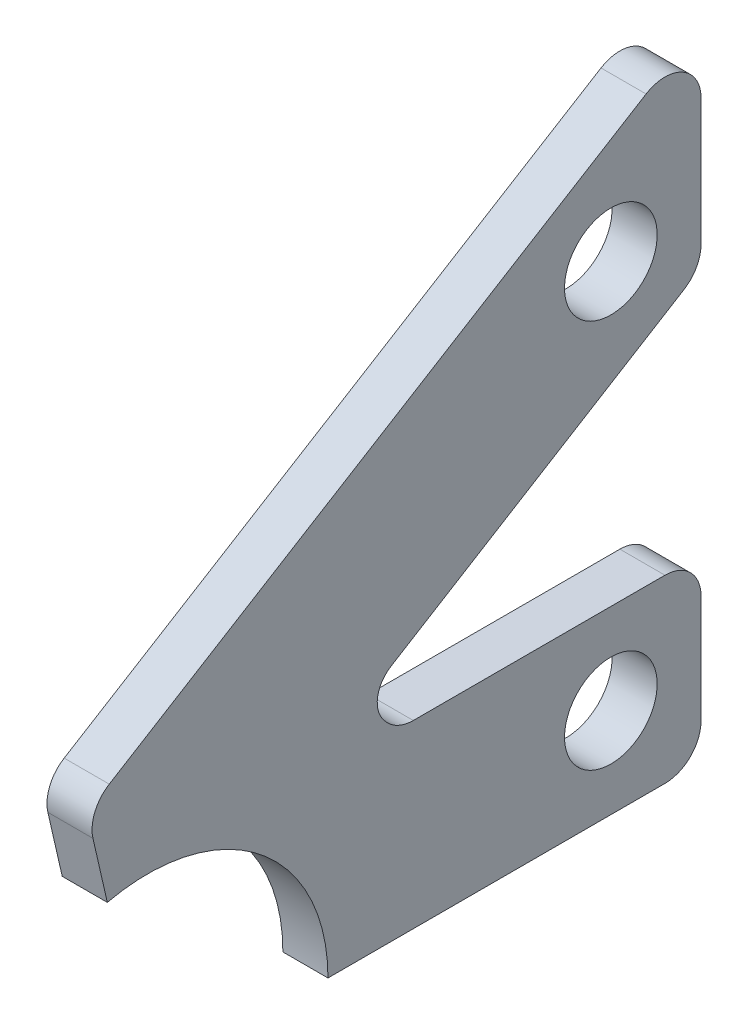
ISO-10303-21;
HEADER;
FILE_DESCRIPTION(('STEP AP214'),'2;1');
FILE_NAME('part.step','',(''),(''),'','','');
FILE_SCHEMA(('AUTOMOTIVE_DESIGN { 1 0 10303 214 1 1 1 1 }'));
ENDSEC;
DATA;
#1=APPLICATION_CONTEXT('core data for automotive mechanical design processes');
#2=APPLICATION_PROTOCOL_DEFINITION('international standard','automotive_design',2000,#1);
#3=PRODUCT_CONTEXT('',#1,'mechanical');
#4=PRODUCT('Part','Part','',(#3));
#5=PRODUCT_RELATED_PRODUCT_CATEGORY('part','',(#4));
#6=PRODUCT_DEFINITION_FORMATION('','',#4);
#7=PRODUCT_DEFINITION_CONTEXT('part definition',#1,'design');
#8=PRODUCT_DEFINITION('design','',#6,#7);
#9=PRODUCT_DEFINITION_SHAPE('','',#8);
#10=(LENGTH_UNIT() NAMED_UNIT(*) SI_UNIT(.MILLI.,.METRE.));
#11=(NAMED_UNIT(*) PLANE_ANGLE_UNIT() SI_UNIT($,.RADIAN.));
#12=(NAMED_UNIT(*) SI_UNIT($,.STERADIAN.) SOLID_ANGLE_UNIT());
#13=UNCERTAINTY_MEASURE_WITH_UNIT(LENGTH_MEASURE(1.E-05),#10,'distance_accuracy_value','');
#14=(GEOMETRIC_REPRESENTATION_CONTEXT(3) GLOBAL_UNCERTAINTY_ASSIGNED_CONTEXT((#13)) GLOBAL_UNIT_ASSIGNED_CONTEXT((#10,
#11,#12)) REPRESENTATION_CONTEXT('',''));
#15=CARTESIAN_POINT('',(0.,0.,0.));
#16=DIRECTION('',(0.,0.,1.));
#17=DIRECTION('',(1.,0.,0.));
#18=AXIS2_PLACEMENT_3D('',#15,#16,#17);
#19=CARTESIAN_POINT('',(-115.73,634.1714119077,38.9687598546462));
#20=DIRECTION('',(1.,0.,0.));
#21=DIRECTION('',(0.,0.,-1.));
#22=AXIS2_PLACEMENT_3D('',#19,#20,#21);
#23=PLANE('',#22);
#24=CARTESIAN_POINT('',(-115.73,634.1714119077,38.9687598546462));
#25=DIRECTION('',(1.,0.,0.));
#26=DIRECTION('',(0.,0.,-1.));
#27=AXIS2_PLACEMENT_3D('',#24,#25,#26);
#28=CIRCLE('',#27,12.7000000000001);
#29=CARTESIAN_POINT('',(-115.73,634.1714119077,26.268759854646));
#30=VERTEX_POINT('',#29);
#31=CARTESIAN_POINT('',(-115.73,646.550348368886,41.8063525121487));
#32=VERTEX_POINT('',#31);
#33=EDGE_CURVE('E224',#30,#32,#28,.T.);
#34=ORIENTED_EDGE('',*,*,#33,.T.);
#35=DIRECTION('',(0.,0.974719406392616,0.223432492716761));
#36=VECTOR('',#35,1.);
#37=CARTESIAN_POINT('',(-115.73,646.550348368886,41.8063525121487));
#38=LINE('',#37,#36);
#39=CARTESIAN_POINT('',(-115.73,650.961224657136,42.8174466564589));
#40=VERTEX_POINT('',#39);
#41=EDGE_CURVE('E132',#32,#40,#38,.T.);
#42=ORIENTED_EDGE('',*,*,#41,.T.);
#43=CARTESIAN_POINT('',(-115.73,651.528743188637,40.3416593642216));
#44=DIRECTION('',(-1.,0.,0.));
#45=DIRECTION('',(0.,0.,1.));
#46=AXIS2_PLACEMENT_3D('',#43,#44,#45);
#47=CIRCLE('',#46,2.54000000000001);
#48=CARTESIAN_POINT('',(-115.73,653.693888378389,41.6697204724902));
#49=VERTEX_POINT('',#48);
#50=EDGE_CURVE('E264',#40,#49,#47,.T.);
#51=ORIENTED_EDGE('',*,*,#50,.T.);
#52=DIRECTION('',(0.,0.522858704042732,-0.852419366043941));
#53=VECTOR('',#52,1.);
#54=CARTESIAN_POINT('',(-115.73,653.693888378389,41.6697204724902));
#55=LINE('',#54,#53);
#56=CARTESIAN_POINT('',(-115.73,676.880746177702,3.8680611082686));
#57=VERTEX_POINT('',#56);
#58=EDGE_CURVE('E283',#49,#57,#55,.T.);
#59=ORIENTED_EDGE('',*,*,#58,.T.);
#60=CARTESIAN_POINT('',(-115.73,674.715600987951,2.53999999999999));
#61=DIRECTION('',(-1.,0.,0.));
#62=DIRECTION('',(0.,0.,-1.));
#63=AXIS2_PLACEMENT_3D('',#60,#61,#62);
#64=CIRCLE('',#63,2.53999999999997);
#65=CARTESIAN_POINT('',(-115.73,674.71560098795,-1.11022302462516E-13));
#66=VERTEX_POINT('',#65);
#67=EDGE_CURVE('E280',#57,#66,#64,.T.);
#68=ORIENTED_EDGE('',*,*,#67,.T.);
#69=DIRECTION('',(0.,-1.,0.));
#70=VECTOR('',#69,1.);
#71=CARTESIAN_POINT('',(-115.73,665.776339043018,1.11022302462516E-13));
#72=LINE('',#71,#70);
#73=CARTESIAN_POINT('',(-115.73,665.776339043018,2.33753988387875E-13));
#74=VERTEX_POINT('',#73);
#75=EDGE_CURVE('E282',#66,#74,#72,.T.);
#76=ORIENTED_EDGE('',*,*,#75,.T.);
#77=CARTESIAN_POINT('',(-115.73,665.776339043018,2.53999999999999));
#78=DIRECTION('',(-1.,0.,0.));
#79=DIRECTION('',(0.,0.,-1.));
#80=AXIS2_PLACEMENT_3D('',#77,#78,#79);
#81=CIRCLE('',#80,2.53999999999975);
#82=CARTESIAN_POINT('',(-115.73,663.611193853267,1.21193889173166));
#83=VERTEX_POINT('',#82);
#84=EDGE_CURVE('E285',#74,#83,#81,.T.);
#85=ORIENTED_EDGE('',*,*,#84,.T.);
#86=DIRECTION('',(0.,-0.522858704042737,0.852419366043938));
#87=VECTOR('',#86,1.);
#88=CARTESIAN_POINT('',(-115.73,650.963145372482,21.8321205666689));
#89=LINE('',#88,#87);
#90=CARTESIAN_POINT('',(-115.73,650.963145372482,21.8321205666689));
#91=VERTEX_POINT('',#90);
#92=EDGE_CURVE('E291',#83,#91,#89,.T.);
#93=ORIENTED_EDGE('',*,*,#92,.T.);
#94=CARTESIAN_POINT('',(-115.73,649.23102922068,20.7696716800541));
#95=DIRECTION('',(1.,0.,0.));
#96=DIRECTION('',(0.,0.,-1.));
#97=AXIS2_PLACEMENT_3D('',#94,#95,#96);
#98=CIRCLE('',#97,2.03200000000014);
#99=CARTESIAN_POINT('',(-115.73,647.935578269026,22.3351846413093));
#100=VERTEX_POINT('',#99);
#101=EDGE_CURVE('E293',#91,#100,#98,.T.);
#102=ORIENTED_EDGE('',*,*,#101,.T.);
#103=CARTESIAN_POINT('',(-115.73,634.1714119077,38.9687598546462));
#104=DIRECTION('',(-1.,0.,0.));
#105=DIRECTION('',(0.,0.,1.));
#106=AXIS2_PLACEMENT_3D('',#103,#104,#105);
#107=CIRCLE('',#106,21.59);
#108=CARTESIAN_POINT('',(-115.73,647.807201381384,22.2297830212382));
#109=VERTEX_POINT('',#108);
#110=EDGE_CURVE('E295',#100,#109,#107,.T.);
#111=ORIENTED_EDGE('',*,*,#110,.T.);
#112=CARTESIAN_POINT('',(-115.73,649.4114119077,20.2604916290725));
#113=DIRECTION('',(1.,0.,0.));
#114=DIRECTION('',(0.,0.,1.));
#115=AXIS2_PLACEMENT_3D('',#112,#113,#114);
#116=CIRCLE('',#115,2.54000000000006);
#117=CARTESIAN_POINT('',(-115.73,646.8714119077,20.2604916290726));
#118=VERTEX_POINT('',#117);
#119=EDGE_CURVE('E297',#109,#118,#116,.T.);
#120=ORIENTED_EDGE('',*,*,#119,.T.);
#121=DIRECTION('',(0.,0.,-1.));
#122=VECTOR('',#121,1.);
#123=CARTESIAN_POINT('',(-115.73,646.871411907699,2.54000000000043));
#124=LINE('',#123,#122);
#125=CARTESIAN_POINT('',(-115.73,646.871411907699,2.54000000000043));
#126=VERTEX_POINT('',#125);
#127=EDGE_CURVE('E299',#118,#126,#124,.T.);
#128=ORIENTED_EDGE('',*,*,#127,.T.);
#129=CARTESIAN_POINT('',(-115.73,644.3314119077,2.54000000000032));
#130=DIRECTION('',(-1.,0.,0.));
#131=DIRECTION('',(0.,0.,1.));
#132=AXIS2_PLACEMENT_3D('',#129,#130,#131);
#133=CIRCLE('',#132,2.53999999999993);
#134=CARTESIAN_POINT('',(-115.73,644.331411907699,3.33066907387547E-13));
#135=VERTEX_POINT('',#134);
#136=EDGE_CURVE('E175',#126,#135,#133,.T.);
#137=ORIENTED_EDGE('',*,*,#136,.T.);
#138=DIRECTION('',(0.,-1.,0.));
#139=VECTOR('',#138,1.);
#140=CARTESIAN_POINT('',(-115.73,636.711411907699,4.44089209850063E-13));
#141=LINE('',#140,#139);
#142=CARTESIAN_POINT('',(-115.73,636.711411907699,4.9960036108132E-13));
#143=VERTEX_POINT('',#142);
#144=EDGE_CURVE('E169',#135,#143,#141,.T.);
#145=ORIENTED_EDGE('',*,*,#144,.T.);
#146=CARTESIAN_POINT('',(-115.73,636.711411907699,2.54000000000043));
#147=DIRECTION('',(-1.,0.,0.));
#148=DIRECTION('',(0.,0.,-1.));
#149=AXIS2_PLACEMENT_3D('',#146,#147,#148);
#150=CIRCLE('',#149,2.53999999999993);
#151=CARTESIAN_POINT('',(-115.73,634.1714119077,2.54000000000043));
#152=VERTEX_POINT('',#151);
#153=EDGE_CURVE('E173',#143,#152,#150,.T.);
#154=ORIENTED_EDGE('',*,*,#153,.T.);
#155=DIRECTION('',(0.,0.,1.));
#156=VECTOR('',#155,1.);
#157=CARTESIAN_POINT('',(-115.73,634.1714119077,2.54000000000043));
#158=LINE('',#157,#156);
#159=EDGE_CURVE('E65',#152,#30,#158,.T.);
#160=ORIENTED_EDGE('',*,*,#159,.T.);
#161=EDGE_LOOP('',(#34,#42,#51,#59,#68,#76,#85,#93,#102,#111,#120,#128,#137,#145,#154,#160));
#162=FACE_BOUND('',#161,.T.);
#163=CARTESIAN_POINT('',(-115.73,640.5214119077,6.3500000000003));
#164=DIRECTION('',(-1.,0.,0.));
#165=DIRECTION('',(0.,0.,1.));
#166=AXIS2_PLACEMENT_3D('',#163,#164,#165);
#167=CIRCLE('',#166,3.2639000000002);
#168=CARTESIAN_POINT('',(-115.73,640.5214119077,9.61390000000051));
#169=VERTEX_POINT('',#168);
#170=EDGE_CURVE('E197',#169,#169,#167,.T.);
#171=ORIENTED_EDGE('',*,*,#170,.F.);
#172=EDGE_LOOP('',(#171));
#173=FACE_BOUND('',#172,.T.);
#174=CARTESIAN_POINT('',(-115.73,667.908984557671,6.35000000000008));
#175=DIRECTION('',(-1.,0.,0.));
#176=DIRECTION('',(0.,0.,1.));
#177=AXIS2_PLACEMENT_3D('',#174,#175,#176);
#178=CIRCLE('',#177,3.26390000000032);
#179=CARTESIAN_POINT('',(-115.73,667.908984557671,9.6139000000004));
#180=VERTEX_POINT('',#179);
#181=EDGE_CURVE('E340',#180,#180,#178,.T.);
#182=ORIENTED_EDGE('',*,*,#181,.F.);
#183=EDGE_LOOP('',(#182));
#184=FACE_BOUND('',#183,.T.);
#185=ADVANCED_FACE('F47',(#162,#173,#184),#23,.F.);
#186=CARTESIAN_POINT('',(-112.555,634.1714119077,38.9687598546462));
#187=DIRECTION('',(1.,0.,0.));
#188=DIRECTION('',(0.,0.,-1.));
#189=AXIS2_PLACEMENT_3D('',#186,#187,#188);
#190=PLANE('',#189);
#191=CARTESIAN_POINT('',(-112.555,640.5214119077,6.3500000000003));
#192=DIRECTION('',(-1.,0.,0.));
#193=DIRECTION('',(0.,0.,1.));
#194=AXIS2_PLACEMENT_3D('',#191,#192,#193);
#195=CIRCLE('',#194,3.2639000000002);
#196=CARTESIAN_POINT('',(-112.555,640.5214119077,9.61390000000051));
#197=VERTEX_POINT('',#196);
#198=EDGE_CURVE('E345',#197,#197,#195,.T.);
#199=ORIENTED_EDGE('',*,*,#198,.T.);
#200=EDGE_LOOP('',(#199));
#201=FACE_BOUND('',#200,.T.);
#202=CARTESIAN_POINT('',(-112.555,634.1714119077,38.9687598546462));
#203=DIRECTION('',(1.,0.,0.));
#204=DIRECTION('',(0.,0.,-1.));
#205=AXIS2_PLACEMENT_3D('',#202,#203,#204);
#206=CIRCLE('',#205,12.7000000000001);
#207=CARTESIAN_POINT('',(-112.555,634.1714119077,26.268759854646));
#208=VERTEX_POINT('',#207);
#209=CARTESIAN_POINT('',(-112.555,646.550348368886,41.8063525121487));
#210=VERTEX_POINT('',#209);
#211=EDGE_CURVE('E193',#208,#210,#206,.T.);
#212=ORIENTED_EDGE('',*,*,#211,.F.);
#213=DIRECTION('',(0.,0.,1.));
#214=VECTOR('',#213,1.);
#215=CARTESIAN_POINT('',(-112.555,634.1714119077,2.54000000000043));
#216=LINE('',#215,#214);
#217=CARTESIAN_POINT('',(-112.555,634.1714119077,2.54000000000043));
#218=VERTEX_POINT('',#217);
#219=EDGE_CURVE('E124',#218,#208,#216,.T.);
#220=ORIENTED_EDGE('',*,*,#219,.F.);
#221=CARTESIAN_POINT('',(-112.555,636.711411907699,2.54000000000043));
#222=DIRECTION('',(-1.,0.,0.));
#223=DIRECTION('',(0.,0.,-1.));
#224=AXIS2_PLACEMENT_3D('',#221,#222,#223);
#225=CIRCLE('',#224,2.53999999999993);
#226=CARTESIAN_POINT('',(-112.555,636.711411907699,4.9960036108132E-13));
#227=VERTEX_POINT('',#226);
#228=EDGE_CURVE('E118',#227,#218,#225,.T.);
#229=ORIENTED_EDGE('',*,*,#228,.F.);
#230=DIRECTION('',(0.,-1.,0.));
#231=VECTOR('',#230,1.);
#232=CARTESIAN_POINT('',(-112.555,636.711411907699,4.44089209850063E-13));
#233=LINE('',#232,#231);
#234=CARTESIAN_POINT('',(-112.555,644.331411907699,3.33066907387547E-13));
#235=VERTEX_POINT('',#234);
#236=EDGE_CURVE('E183',#235,#227,#233,.T.);
#237=ORIENTED_EDGE('',*,*,#236,.F.);
#238=CARTESIAN_POINT('',(-112.555,644.3314119077,2.54000000000032));
#239=DIRECTION('',(-1.,0.,0.));
#240=DIRECTION('',(0.,0.,1.));
#241=AXIS2_PLACEMENT_3D('',#238,#239,#240);
#242=CIRCLE('',#241,2.53999999999993);
#243=CARTESIAN_POINT('',(-112.555,646.871411907699,2.54000000000043));
#244=VERTEX_POINT('',#243);
#245=EDGE_CURVE('E219',#244,#235,#242,.T.);
#246=ORIENTED_EDGE('',*,*,#245,.F.);
#247=DIRECTION('',(0.,0.,-1.));
#248=VECTOR('',#247,1.);
#249=CARTESIAN_POINT('',(-112.555,646.871411907699,2.54000000000043));
#250=LINE('',#249,#248);
#251=CARTESIAN_POINT('',(-112.555,646.8714119077,20.2604916290726));
#252=VERTEX_POINT('',#251);
#253=EDGE_CURVE('E217',#252,#244,#250,.T.);
#254=ORIENTED_EDGE('',*,*,#253,.F.);
#255=CARTESIAN_POINT('',(-112.555,649.4114119077,20.2604916290725));
#256=DIRECTION('',(1.,0.,0.));
#257=DIRECTION('',(0.,0.,1.));
#258=AXIS2_PLACEMENT_3D('',#255,#256,#257);
#259=CIRCLE('',#258,2.54000000000006);
#260=CARTESIAN_POINT('',(-112.555,647.807201381384,22.2297830212382));
#261=VERTEX_POINT('',#260);
#262=EDGE_CURVE('E215',#261,#252,#259,.T.);
#263=ORIENTED_EDGE('',*,*,#262,.F.);
#264=CARTESIAN_POINT('',(-112.555,634.1714119077,38.9687598546462));
#265=DIRECTION('',(-1.,0.,0.));
#266=DIRECTION('',(0.,0.,1.));
#267=AXIS2_PLACEMENT_3D('',#264,#265,#266);
#268=CIRCLE('',#267,21.59);
#269=CARTESIAN_POINT('',(-112.555,647.935578269026,22.3351846413093));
#270=VERTEX_POINT('',#269);
#271=EDGE_CURVE('E213',#270,#261,#268,.T.);
#272=ORIENTED_EDGE('',*,*,#271,.F.);
#273=CARTESIAN_POINT('',(-112.555,649.23102922068,20.7696716800541));
#274=DIRECTION('',(1.,0.,0.));
#275=DIRECTION('',(0.,0.,-1.));
#276=AXIS2_PLACEMENT_3D('',#273,#274,#275);
#277=CIRCLE('',#276,2.03200000000014);
#278=CARTESIAN_POINT('',(-112.555,650.963145372482,21.8321205666689));
#279=VERTEX_POINT('',#278);
#280=EDGE_CURVE('E211',#279,#270,#277,.T.);
#281=ORIENTED_EDGE('',*,*,#280,.F.);
#282=DIRECTION('',(0.,-0.522858704042737,0.852419366043938));
#283=VECTOR('',#282,1.);
#284=CARTESIAN_POINT('',(-112.555,650.963145372482,21.8321205666689));
#285=LINE('',#284,#283);
#286=CARTESIAN_POINT('',(-112.555,663.611193853267,1.21193889173166));
#287=VERTEX_POINT('',#286);
#288=EDGE_CURVE('E209',#287,#279,#285,.T.);
#289=ORIENTED_EDGE('',*,*,#288,.F.);
#290=CARTESIAN_POINT('',(-112.555,665.776339043018,2.53999999999999));
#291=DIRECTION('',(-1.,0.,0.));
#292=DIRECTION('',(0.,0.,-1.));
#293=AXIS2_PLACEMENT_3D('',#290,#291,#292);
#294=CIRCLE('',#293,2.53999999999975);
#295=CARTESIAN_POINT('',(-112.555,665.776339043018,2.33753988387875E-13));
#296=VERTEX_POINT('',#295);
#297=EDGE_CURVE('E207',#296,#287,#294,.T.);
#298=ORIENTED_EDGE('',*,*,#297,.F.);
#299=DIRECTION('',(0.,-1.,0.));
#300=VECTOR('',#299,1.);
#301=CARTESIAN_POINT('',(-112.555,665.776339043018,1.11022302462516E-13));
#302=LINE('',#301,#300);
#303=CARTESIAN_POINT('',(-112.555,674.71560098795,-1.11022302462516E-13));
#304=VERTEX_POINT('',#303);
#305=EDGE_CURVE('E205',#304,#296,#302,.T.);
#306=ORIENTED_EDGE('',*,*,#305,.F.);
#307=CARTESIAN_POINT('',(-112.555,674.715600987951,2.53999999999999));
#308=DIRECTION('',(-1.,0.,0.));
#309=DIRECTION('',(0.,0.,-1.));
#310=AXIS2_PLACEMENT_3D('',#307,#308,#309);
#311=CIRCLE('',#310,2.53999999999997);
#312=CARTESIAN_POINT('',(-112.555,676.880746177702,3.8680611082686));
#313=VERTEX_POINT('',#312);
#314=EDGE_CURVE('E203',#313,#304,#311,.T.);
#315=ORIENTED_EDGE('',*,*,#314,.F.);
#316=DIRECTION('',(0.,0.522858704042732,-0.852419366043941));
#317=VECTOR('',#316,1.);
#318=CARTESIAN_POINT('',(-112.555,653.693888378389,41.6697204724902));
#319=LINE('',#318,#317);
#320=CARTESIAN_POINT('',(-112.555,653.693888378389,41.6697204724902));
#321=VERTEX_POINT('',#320);
#322=EDGE_CURVE('E201',#321,#313,#319,.T.);
#323=ORIENTED_EDGE('',*,*,#322,.F.);
#324=CARTESIAN_POINT('',(-112.555,651.528743188637,40.3416593642216));
#325=DIRECTION('',(-1.,0.,0.));
#326=DIRECTION('',(0.,0.,1.));
#327=AXIS2_PLACEMENT_3D('',#324,#325,#326);
#328=CIRCLE('',#327,2.54000000000001);
#329=CARTESIAN_POINT('',(-112.555,650.961224657136,42.8174466564589));
#330=VERTEX_POINT('',#329);
#331=EDGE_CURVE('E199',#330,#321,#328,.T.);
#332=ORIENTED_EDGE('',*,*,#331,.F.);
#333=DIRECTION('',(0.,0.974719406392616,0.223432492716761));
#334=VECTOR('',#333,1.);
#335=CARTESIAN_POINT('',(-112.555,646.550348368886,41.8063525121487));
#336=LINE('',#335,#334);
#337=EDGE_CURVE('E196',#210,#330,#336,.T.);
#338=ORIENTED_EDGE('',*,*,#337,.F.);
#339=EDGE_LOOP('',(#212,#220,#229,#237,#246,#254,#263,#272,#281,#289,#298,#306,#315,#323,#332,#338));
#340=FACE_BOUND('',#339,.T.);
#341=CARTESIAN_POINT('',(-112.555,667.908984557671,6.35000000000008));
#342=DIRECTION('',(-1.,0.,0.));
#343=DIRECTION('',(0.,0.,1.));
#344=AXIS2_PLACEMENT_3D('',#341,#342,#343);
#345=CIRCLE('',#344,3.26390000000032);
#346=CARTESIAN_POINT('',(-112.555,667.908984557671,9.6139000000004));
#347=VERTEX_POINT('',#346);
#348=EDGE_CURVE('E343',#347,#347,#345,.T.);
#349=ORIENTED_EDGE('',*,*,#348,.T.);
#350=EDGE_LOOP('',(#349));
#351=FACE_BOUND('',#350,.T.);
#352=ADVANCED_FACE('F268',(#201,#340,#351),#190,.T.);
#353=CARTESIAN_POINT('',(-115.73,634.1714119077,38.9687598546462));
#354=DIRECTION('',(1.,0.,0.));
#355=DIRECTION('',(0.,0.,-1.));
#356=AXIS2_PLACEMENT_3D('',#353,#354,#355);
#357=CYLINDRICAL_SURFACE('',#356,12.7000000000001);
#358=ORIENTED_EDGE('',*,*,#211,.T.);
#359=DIRECTION('',(1.,0.,0.));
#360=VECTOR('',#359,1.);
#361=CARTESIAN_POINT('',(-115.73,646.550348368886,41.8063525121487));
#362=LINE('',#361,#360);
#363=EDGE_CURVE('E11',#32,#210,#362,.T.);
#364=ORIENTED_EDGE('',*,*,#363,.F.);
#365=ORIENTED_EDGE('',*,*,#33,.F.);
#366=DIRECTION('',(1.,0.,0.));
#367=VECTOR('',#366,1.);
#368=CARTESIAN_POINT('',(-115.73,634.1714119077,26.268759854646));
#369=LINE('',#368,#367);
#370=EDGE_CURVE('E189',#30,#208,#369,.T.);
#371=ORIENTED_EDGE('',*,*,#370,.T.);
#372=EDGE_LOOP('',(#358,#364,#365,#371));
#373=FACE_BOUND('',#372,.T.);
#374=ADVANCED_FACE('F49',(#373),#357,.F.);
#375=CARTESIAN_POINT('',(-115.73,646.550348368886,41.8063525121487));
#376=DIRECTION('',(0.,0.223432492716761,-0.974719406392616));
#377=DIRECTION('',(0.,0.974719406392616,0.223432492716761));
#378=AXIS2_PLACEMENT_3D('',#375,#376,#377);
#379=PLANE('',#378);
#380=ORIENTED_EDGE('',*,*,#337,.T.);
#381=DIRECTION('',(1.,0.,0.));
#382=VECTOR('',#381,1.);
#383=CARTESIAN_POINT('',(-115.73,650.961224657136,42.8174466564589));
#384=LINE('',#383,#382);
#385=EDGE_CURVE('E57',#40,#330,#384,.T.);
#386=ORIENTED_EDGE('',*,*,#385,.F.);
#387=ORIENTED_EDGE('',*,*,#41,.F.);
#388=ORIENTED_EDGE('',*,*,#363,.T.);
#389=EDGE_LOOP('',(#380,#386,#387,#388));
#390=FACE_BOUND('',#389,.T.);
#391=ADVANCED_FACE('F482',(#390),#379,.F.);
#392=CARTESIAN_POINT('',(-115.73,651.528743188637,40.3416593642216));
#393=DIRECTION('',(1.,0.,0.));
#394=DIRECTION('',(0.,0.,-1.));
#395=AXIS2_PLACEMENT_3D('',#392,#393,#394);
#396=CYLINDRICAL_SURFACE('',#395,2.54000000000001);
#397=ORIENTED_EDGE('',*,*,#331,.T.);
#398=DIRECTION('',(1.,0.,0.));
#399=VECTOR('',#398,1.);
#400=CARTESIAN_POINT('',(-115.73,653.693888378389,41.6697204724902));
#401=LINE('',#400,#399);
#402=EDGE_CURVE('E256',#49,#321,#401,.T.);
#403=ORIENTED_EDGE('',*,*,#402,.F.);
#404=ORIENTED_EDGE('',*,*,#50,.F.);
#405=ORIENTED_EDGE('',*,*,#385,.T.);
#406=EDGE_LOOP('',(#397,#403,#404,#405));
#407=FACE_BOUND('',#406,.T.);
#408=ADVANCED_FACE('F262',(#407),#396,.T.);
#409=CARTESIAN_POINT('',(-115.73,653.693888378389,41.6697204724902));
#410=DIRECTION('',(0.,-0.852419366043941,-0.522858704042732));
#411=DIRECTION('',(0.,0.522858704042732,-0.852419366043941));
#412=AXIS2_PLACEMENT_3D('',#409,#410,#411);
#413=PLANE('',#412);
#414=ORIENTED_EDGE('',*,*,#322,.T.);
#415=DIRECTION('',(1.,0.,0.));
#416=VECTOR('',#415,1.);
#417=CARTESIAN_POINT('',(-115.73,676.880746177702,3.8680611082686));
#418=LINE('',#417,#416);
#419=EDGE_CURVE('E253',#57,#313,#418,.T.);
#420=ORIENTED_EDGE('',*,*,#419,.F.);
#421=ORIENTED_EDGE('',*,*,#58,.F.);
#422=ORIENTED_EDGE('',*,*,#402,.T.);
#423=EDGE_LOOP('',(#414,#420,#421,#422));
#424=FACE_BOUND('',#423,.T.);
#425=ADVANCED_FACE('F274',(#424),#413,.F.);
#426=CARTESIAN_POINT('',(-115.73,674.715600987951,2.53999999999999));
#427=DIRECTION('',(1.,0.,0.));
#428=DIRECTION('',(0.,0.,-1.));
#429=AXIS2_PLACEMENT_3D('',#426,#427,#428);
#430=CYLINDRICAL_SURFACE('',#429,2.53999999999997);
#431=ORIENTED_EDGE('',*,*,#314,.T.);
#432=DIRECTION('',(1.,0.,0.));
#433=VECTOR('',#432,1.);
#434=CARTESIAN_POINT('',(-115.73,674.71560098795,-1.11022302462516E-13));
#435=LINE('',#434,#433);
#436=EDGE_CURVE('E250',#66,#304,#435,.T.);
#437=ORIENTED_EDGE('',*,*,#436,.F.);
#438=ORIENTED_EDGE('',*,*,#67,.F.);
#439=ORIENTED_EDGE('',*,*,#419,.T.);
#440=EDGE_LOOP('',(#431,#437,#438,#439));
#441=FACE_BOUND('',#440,.T.);
#442=ADVANCED_FACE('F278',(#441),#430,.T.);
#443=CARTESIAN_POINT('',(-115.73,665.776339043018,1.11022302462516E-13));
#444=DIRECTION('',(0.,0.,1.));
#445=DIRECTION('',(0.,-1.,0.));
#446=AXIS2_PLACEMENT_3D('',#443,#444,#445);
#447=PLANE('',#446);
#448=ORIENTED_EDGE('',*,*,#305,.T.);
#449=DIRECTION('',(1.,0.,0.));
#450=VECTOR('',#449,1.);
#451=CARTESIAN_POINT('',(-115.73,665.776339043018,2.33753988387875E-13));
#452=LINE('',#451,#450);
#453=EDGE_CURVE('E247',#74,#296,#452,.T.);
#454=ORIENTED_EDGE('',*,*,#453,.F.);
#455=ORIENTED_EDGE('',*,*,#75,.F.);
#456=ORIENTED_EDGE('',*,*,#436,.T.);
#457=EDGE_LOOP('',(#448,#454,#455,#456));
#458=FACE_BOUND('',#457,.T.);
#459=ADVANCED_FACE('F447',(#458),#447,.F.);
#460=CARTESIAN_POINT('',(-115.73,665.776339043018,2.53999999999999));
#461=DIRECTION('',(1.,0.,0.));
#462=DIRECTION('',(0.,0.,-1.));
#463=AXIS2_PLACEMENT_3D('',#460,#461,#462);
#464=CYLINDRICAL_SURFACE('',#463,2.53999999999975);
#465=ORIENTED_EDGE('',*,*,#297,.T.);
#466=DIRECTION('',(1.,0.,0.));
#467=VECTOR('',#466,1.);
#468=CARTESIAN_POINT('',(-115.73,663.611193853267,1.21193889173166));
#469=LINE('',#468,#467);
#470=EDGE_CURVE('E244',#83,#287,#469,.T.);
#471=ORIENTED_EDGE('',*,*,#470,.F.);
#472=ORIENTED_EDGE('',*,*,#84,.F.);
#473=ORIENTED_EDGE('',*,*,#453,.T.);
#474=EDGE_LOOP('',(#465,#471,#472,#473));
#475=FACE_BOUND('',#474,.T.);
#476=ADVANCED_FACE('F437',(#475),#464,.T.);
#477=CARTESIAN_POINT('',(-115.73,650.963145372482,21.8321205666689));
#478=DIRECTION('',(0.,0.852419366043938,0.522858704042737));
#479=DIRECTION('',(0.,-0.522858704042737,0.852419366043938));
#480=AXIS2_PLACEMENT_3D('',#477,#478,#479);
#481=PLANE('',#480);
#482=ORIENTED_EDGE('',*,*,#288,.T.);
#483=DIRECTION('',(1.,0.,0.));
#484=VECTOR('',#483,1.);
#485=CARTESIAN_POINT('',(-115.73,650.963145372482,21.8321205666689));
#486=LINE('',#485,#484);
#487=EDGE_CURVE('E241',#91,#279,#486,.T.);
#488=ORIENTED_EDGE('',*,*,#487,.F.);
#489=ORIENTED_EDGE('',*,*,#92,.F.);
#490=ORIENTED_EDGE('',*,*,#470,.T.);
#491=EDGE_LOOP('',(#482,#488,#489,#490));
#492=FACE_BOUND('',#491,.T.);
#493=ADVANCED_FACE('F427',(#492),#481,.F.);
#494=CARTESIAN_POINT('',(-115.73,649.23102922068,20.7696716800541));
#495=DIRECTION('',(1.,0.,0.));
#496=DIRECTION('',(0.,0.,-1.));
#497=AXIS2_PLACEMENT_3D('',#494,#495,#496);
#498=CYLINDRICAL_SURFACE('',#497,2.03200000000014);
#499=ORIENTED_EDGE('',*,*,#280,.T.);
#500=DIRECTION('',(1.,0.,0.));
#501=VECTOR('',#500,1.);
#502=CARTESIAN_POINT('',(-115.73,647.935578269026,22.3351846413093));
#503=LINE('',#502,#501);
#504=EDGE_CURVE('E238',#100,#270,#503,.T.);
#505=ORIENTED_EDGE('',*,*,#504,.F.);
#506=ORIENTED_EDGE('',*,*,#101,.F.);
#507=ORIENTED_EDGE('',*,*,#487,.T.);
#508=EDGE_LOOP('',(#499,#505,#506,#507));
#509=FACE_BOUND('',#508,.T.);
#510=ADVANCED_FACE('F417',(#509),#498,.F.);
#511=CARTESIAN_POINT('',(-115.73,634.1714119077,38.9687598546462));
#512=DIRECTION('',(1.,0.,0.));
#513=DIRECTION('',(0.,0.,-1.));
#514=AXIS2_PLACEMENT_3D('',#511,#512,#513);
#515=CYLINDRICAL_SURFACE('',#514,21.59);
#516=ORIENTED_EDGE('',*,*,#271,.T.);
#517=DIRECTION('',(1.,0.,0.));
#518=VECTOR('',#517,1.);
#519=CARTESIAN_POINT('',(-115.73,647.807201381384,22.2297830212382));
#520=LINE('',#519,#518);
#521=EDGE_CURVE('E235',#109,#261,#520,.T.);
#522=ORIENTED_EDGE('',*,*,#521,.F.);
#523=ORIENTED_EDGE('',*,*,#110,.F.);
#524=ORIENTED_EDGE('',*,*,#504,.T.);
#525=EDGE_LOOP('',(#516,#522,#523,#524));
#526=FACE_BOUND('',#525,.T.);
#527=ADVANCED_FACE('F407',(#526),#515,.T.);
#528=CARTESIAN_POINT('',(-115.73,649.4114119077,20.2604916290725));
#529=DIRECTION('',(1.,0.,0.));
#530=DIRECTION('',(0.,0.,-1.));
#531=AXIS2_PLACEMENT_3D('',#528,#529,#530);
#532=CYLINDRICAL_SURFACE('',#531,2.54000000000006);
#533=ORIENTED_EDGE('',*,*,#262,.T.);
#534=DIRECTION('',(1.,0.,0.));
#535=VECTOR('',#534,1.);
#536=CARTESIAN_POINT('',(-115.73,646.8714119077,20.2604916290726));
#537=LINE('',#536,#535);
#538=EDGE_CURVE('E232',#118,#252,#537,.T.);
#539=ORIENTED_EDGE('',*,*,#538,.F.);
#540=ORIENTED_EDGE('',*,*,#119,.F.);
#541=ORIENTED_EDGE('',*,*,#521,.T.);
#542=EDGE_LOOP('',(#533,#539,#540,#541));
#543=FACE_BOUND('',#542,.T.);
#544=ADVANCED_FACE('F398',(#543),#532,.F.);
#545=CARTESIAN_POINT('',(-115.73,646.871411907699,2.54000000000043));
#546=DIRECTION('',(0.,-1.,0.));
#547=DIRECTION('',(0.,0.,-1.));
#548=AXIS2_PLACEMENT_3D('',#545,#546,#547);
#549=PLANE('',#548);
#550=ORIENTED_EDGE('',*,*,#253,.T.);
#551=DIRECTION('',(1.,0.,0.));
#552=VECTOR('',#551,1.);
#553=CARTESIAN_POINT('',(-115.73,646.871411907699,2.54000000000043));
#554=LINE('',#553,#552);
#555=EDGE_CURVE('E229',#126,#244,#554,.T.);
#556=ORIENTED_EDGE('',*,*,#555,.F.);
#557=ORIENTED_EDGE('',*,*,#127,.F.);
#558=ORIENTED_EDGE('',*,*,#538,.T.);
#559=EDGE_LOOP('',(#550,#556,#557,#558));
#560=FACE_BOUND('',#559,.T.);
#561=ADVANCED_FACE('F305',(#560),#549,.F.);
#562=CARTESIAN_POINT('',(-115.73,644.3314119077,2.54000000000032));
#563=DIRECTION('',(1.,0.,0.));
#564=DIRECTION('',(0.,0.,-1.));
#565=AXIS2_PLACEMENT_3D('',#562,#563,#564);
#566=CYLINDRICAL_SURFACE('',#565,2.53999999999993);
#567=ORIENTED_EDGE('',*,*,#245,.T.);
#568=DIRECTION('',(1.,0.,0.));
#569=VECTOR('',#568,1.);
#570=CARTESIAN_POINT('',(-115.73,644.331411907699,3.33066907387547E-13));
#571=LINE('',#570,#569);
#572=EDGE_CURVE('E184',#135,#235,#571,.T.);
#573=ORIENTED_EDGE('',*,*,#572,.F.);
#574=ORIENTED_EDGE('',*,*,#136,.F.);
#575=ORIENTED_EDGE('',*,*,#555,.T.);
#576=EDGE_LOOP('',(#567,#573,#574,#575));
#577=FACE_BOUND('',#576,.T.);
#578=ADVANCED_FACE('F309',(#577),#566,.T.);
#579=CARTESIAN_POINT('',(-115.73,636.711411907699,4.44089209850063E-13));
#580=DIRECTION('',(0.,0.,1.));
#581=DIRECTION('',(0.,-1.,0.));
#582=AXIS2_PLACEMENT_3D('',#579,#580,#581);
#583=PLANE('',#582);
#584=ORIENTED_EDGE('',*,*,#236,.T.);
#585=DIRECTION('',(1.,0.,0.));
#586=VECTOR('',#585,1.);
#587=CARTESIAN_POINT('',(-115.73,636.711411907699,4.9960036108132E-13));
#588=LINE('',#587,#586);
#589=EDGE_CURVE('E180',#143,#227,#588,.T.);
#590=ORIENTED_EDGE('',*,*,#589,.F.);
#591=ORIENTED_EDGE('',*,*,#144,.F.);
#592=ORIENTED_EDGE('',*,*,#572,.T.);
#593=EDGE_LOOP('',(#584,#590,#591,#592));
#594=FACE_BOUND('',#593,.T.);
#595=ADVANCED_FACE('F181',(#594),#583,.F.);
#596=CARTESIAN_POINT('',(-115.73,636.711411907699,2.54000000000043));
#597=DIRECTION('',(1.,0.,0.));
#598=DIRECTION('',(0.,0.,-1.));
#599=AXIS2_PLACEMENT_3D('',#596,#597,#598);
#600=CYLINDRICAL_SURFACE('',#599,2.53999999999993);
#601=ORIENTED_EDGE('',*,*,#228,.T.);
#602=DIRECTION('',(1.,0.,0.));
#603=VECTOR('',#602,1.);
#604=CARTESIAN_POINT('',(-115.73,634.1714119077,2.54000000000043));
#605=LINE('',#604,#603);
#606=EDGE_CURVE('E185',#152,#218,#605,.T.);
#607=ORIENTED_EDGE('',*,*,#606,.F.);
#608=ORIENTED_EDGE('',*,*,#153,.F.);
#609=ORIENTED_EDGE('',*,*,#589,.T.);
#610=EDGE_LOOP('',(#601,#607,#608,#609));
#611=FACE_BOUND('',#610,.T.);
#612=ADVANCED_FACE('F187',(#611),#600,.T.);
#613=CARTESIAN_POINT('',(-115.73,634.1714119077,2.54000000000043));
#614=DIRECTION('',(0.,1.,0.));
#615=DIRECTION('',(0.,0.,1.));
#616=AXIS2_PLACEMENT_3D('',#613,#614,#615);
#617=PLANE('',#616);
#618=ORIENTED_EDGE('',*,*,#219,.T.);
#619=ORIENTED_EDGE('',*,*,#370,.F.);
#620=ORIENTED_EDGE('',*,*,#159,.F.);
#621=ORIENTED_EDGE('',*,*,#606,.T.);
#622=EDGE_LOOP('',(#618,#619,#620,#621));
#623=FACE_BOUND('',#622,.T.);
#624=ADVANCED_FACE('F313',(#623),#617,.F.);
#625=CARTESIAN_POINT('',(-115.73,640.5214119077,6.3500000000003));
#626=DIRECTION('',(1.,0.,0.));
#627=DIRECTION('',(0.,0.,-1.));
#628=AXIS2_PLACEMENT_3D('',#625,#626,#627);
#629=CYLINDRICAL_SURFACE('',#628,3.2639000000002);
#630=ORIENTED_EDGE('',*,*,#170,.T.);
#631=EDGE_LOOP('',(#630));
#632=FACE_BOUND('',#631,.T.);
#633=ORIENTED_EDGE('',*,*,#198,.F.);
#634=EDGE_LOOP('',(#633));
#635=FACE_BOUND('',#634,.T.);
#636=ADVANCED_FACE('F315',(#632,#635),#629,.F.);
#637=CARTESIAN_POINT('',(-115.73,667.908984557671,6.35000000000008));
#638=DIRECTION('',(1.,0.,0.));
#639=DIRECTION('',(0.,0.,-1.));
#640=AXIS2_PLACEMENT_3D('',#637,#638,#639);
#641=CYLINDRICAL_SURFACE('',#640,3.26390000000032);
#642=ORIENTED_EDGE('',*,*,#181,.T.);
#643=EDGE_LOOP('',(#642));
#644=FACE_BOUND('',#643,.T.);
#645=ORIENTED_EDGE('',*,*,#348,.F.);
#646=EDGE_LOOP('',(#645));
#647=FACE_BOUND('',#646,.T.);
#648=ADVANCED_FACE('F321',(#644,#647),#641,.F.);
#649=CLOSED_SHELL('',(#185,#352,#374,#391,#408,#425,#442,#459,#476,#493,#510,#527,#544,#561,
#578,#595,#612,#624,#636,#648));
#650=MANIFOLD_SOLID_BREP('B2',#649);
#651=ADVANCED_BREP_SHAPE_REPRESENTATION('',(#18,#650),#14);
#652=SHAPE_DEFINITION_REPRESENTATION(#9,#651);
ENDSEC;
END-ISO-10303-21;
